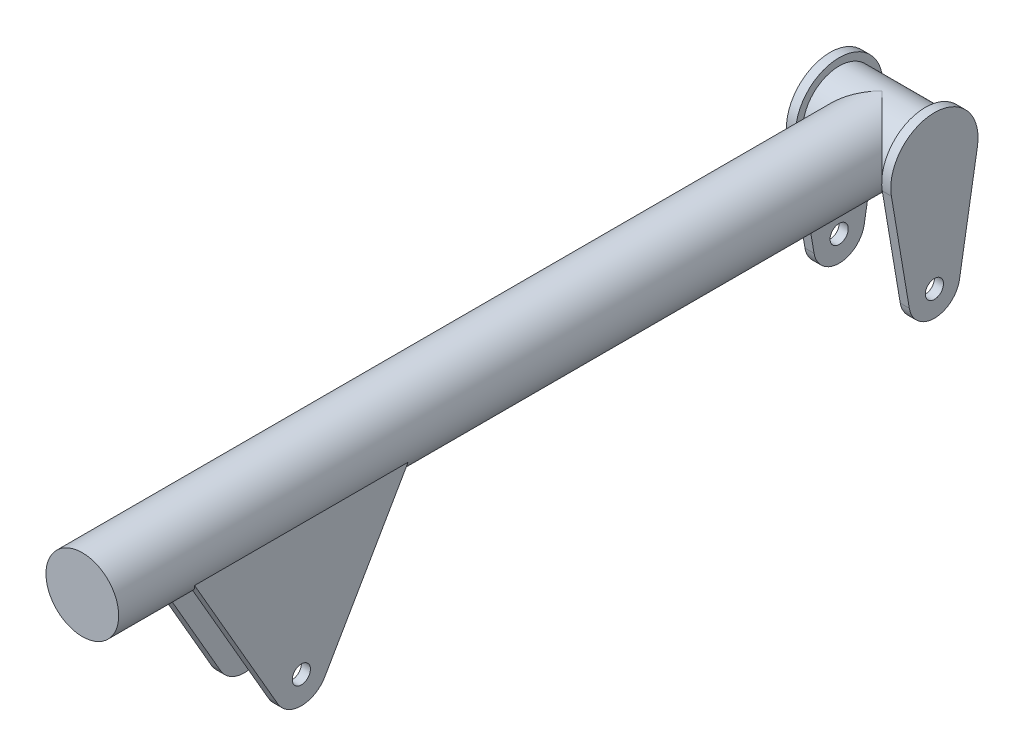
ISO-10303-21;
HEADER;
FILE_DESCRIPTION(('STEP AP214'),'2;1');
FILE_NAME('part.step','',(''),(''),'','','');
FILE_SCHEMA(('AUTOMOTIVE_DESIGN { 1 0 10303 214 1 1 1 1 }'));
ENDSEC;
DATA;
#1=APPLICATION_CONTEXT('core data for automotive mechanical design processes');
#2=APPLICATION_PROTOCOL_DEFINITION('international standard','automotive_design',2000,#1);
#3=PRODUCT_CONTEXT('',#1,'mechanical');
#4=PRODUCT('Part','Part','',(#3));
#5=PRODUCT_RELATED_PRODUCT_CATEGORY('part','',(#4));
#6=PRODUCT_DEFINITION_FORMATION('','',#4);
#7=PRODUCT_DEFINITION_CONTEXT('part definition',#1,'design');
#8=PRODUCT_DEFINITION('design','',#6,#7);
#9=PRODUCT_DEFINITION_SHAPE('','',#8);
#10=(LENGTH_UNIT() NAMED_UNIT(*) SI_UNIT(.MILLI.,.METRE.));
#11=(NAMED_UNIT(*) PLANE_ANGLE_UNIT() SI_UNIT($,.RADIAN.));
#12=(NAMED_UNIT(*) SI_UNIT($,.STERADIAN.) SOLID_ANGLE_UNIT());
#13=UNCERTAINTY_MEASURE_WITH_UNIT(LENGTH_MEASURE(1.E-05),#10,'distance_accuracy_value','');
#14=(GEOMETRIC_REPRESENTATION_CONTEXT(3) GLOBAL_UNCERTAINTY_ASSIGNED_CONTEXT((#13)) GLOBAL_UNIT_ASSIGNED_CONTEXT((#10,
#11,#12)) REPRESENTATION_CONTEXT('',''));
#15=CARTESIAN_POINT('',(0.,0.,0.));
#16=DIRECTION('',(0.,0.,1.));
#17=DIRECTION('',(1.,0.,0.));
#18=AXIS2_PLACEMENT_3D('',#15,#16,#17);
#19=CARTESIAN_POINT('',(0.,0.,279.4));
#20=DIRECTION('',(0.,0.,-1.));
#21=DIRECTION('',(-1.,0.,0.));
#22=AXIS2_PLACEMENT_3D('',#19,#20,#21);
#23=CYLINDRICAL_SURFACE('',#22,12.7);
#24=CARTESIAN_POINT('',(0.,0.,0.));
#25=DIRECTION('',(-0.707106781186547,0.,0.707106781186548));
#26=DIRECTION('',(-0.707106781186547,0.,-0.707106781186548));
#27=AXIS2_PLACEMENT_3D('',#24,#25,#26);
#28=ELLIPSE('',#27,17.9605122421383,12.7);
#29=CARTESIAN_POINT('',(0.,-12.7,0.));
#30=VERTEX_POINT('',#29);
#31=CARTESIAN_POINT('',(0.,12.7,0.));
#32=VERTEX_POINT('',#31);
#33=EDGE_CURVE('E324',#30,#32,#28,.T.);
#34=ORIENTED_EDGE('',*,*,#33,.T.);
#35=CARTESIAN_POINT('',(0.,0.,0.));
#36=DIRECTION('',(-0.707106781186547,0.,-0.707106781186548));
#37=DIRECTION('',(-0.707106781186547,0.,0.707106781186548));
#38=AXIS2_PLACEMENT_3D('',#35,#36,#37);
#39=ELLIPSE('',#38,17.9605122421383,12.7);
#40=EDGE_CURVE('E327',#32,#30,#39,.F.);
#41=ORIENTED_EDGE('',*,*,#40,.T.);
#42=EDGE_LOOP('',(#34,#41));
#43=FACE_BOUND('',#42,.T.);
#44=CARTESIAN_POINT('',(0.,0.,279.4));
#45=DIRECTION('',(0.,0.,1.));
#46=DIRECTION('',(1.,0.,0.));
#47=AXIS2_PLACEMENT_3D('',#44,#45,#46);
#48=CIRCLE('',#47,12.7);
#49=CARTESIAN_POINT('',(12.7,0.,279.4));
#50=VERTEX_POINT('',#49);
#51=EDGE_CURVE('E283',#50,#50,#48,.T.);
#52=ORIENTED_EDGE('',*,*,#51,.F.);
#53=EDGE_LOOP('',(#52));
#54=FACE_BOUND('',#53,.T.);
#55=CARTESIAN_POINT('',(0.,0.,254.785403517121));
#56=DIRECTION('',(0.,0.499999999999998,-0.86602540378444));
#57=DIRECTION('',(0.,-0.86602540378444,-0.499999999999998));
#58=AXIS2_PLACEMENT_3D('',#55,#56,#57);
#59=ELLIPSE('',#58,14.6646968374165,12.7);
#60=CARTESIAN_POINT('',(11.557,-5.2655247601735,251.745351379411));
#61=VERTEX_POINT('',#60);
#62=CARTESIAN_POINT('',(8.382,-9.54107310526442,249.276862391439));
#63=VERTEX_POINT('',#62);
#64=EDGE_CURVE('E333',#61,#63,#59,.T.);
#65=ORIENTED_EDGE('',*,*,#64,.F.);
#66=DIRECTION('',(0.,0.,-1.));
#67=VECTOR('',#66,1.);
#68=CARTESIAN_POINT('',(11.557,-5.26552476017348,279.4));
#69=LINE('',#68,#67);
#70=CARTESIAN_POINT('',(11.557,-5.2655247601735,177.169623049042));
#71=VERTEX_POINT('',#70);
#72=EDGE_CURVE('E12',#61,#71,#69,.T.);
#73=ORIENTED_EDGE('',*,*,#72,.T.);
#74=CARTESIAN_POINT('',(0.,0.,174.129570911331));
#75=DIRECTION('',(0.,0.499999999999998,0.86602540378444));
#76=DIRECTION('',(0.,0.86602540378444,-0.499999999999998));
#77=AXIS2_PLACEMENT_3D('',#74,#75,#76);
#78=ELLIPSE('',#77,14.6646968374165,12.7);
#79=CARTESIAN_POINT('',(8.382,-9.54107310526443,179.638112037013));
#80=VERTEX_POINT('',#79);
#81=EDGE_CURVE('E64',#80,#71,#78,.T.);
#82=ORIENTED_EDGE('',*,*,#81,.F.);
#83=DIRECTION('',(0.,0.,-1.));
#84=VECTOR('',#83,1.);
#85=CARTESIAN_POINT('',(8.382,-9.54107310526442,279.4));
#86=LINE('',#85,#84);
#87=EDGE_CURVE('E330',#63,#80,#86,.T.);
#88=ORIENTED_EDGE('',*,*,#87,.F.);
#89=EDGE_LOOP('',(#65,#73,#82,#88));
#90=FACE_BOUND('',#89,.T.);
#91=CARTESIAN_POINT('',(0.,0.,174.129570911331));
#92=DIRECTION('',(0.,-0.499999999999998,-0.86602540378444));
#93=DIRECTION('',(0.,0.86602540378444,-0.499999999999998));
#94=AXIS2_PLACEMENT_3D('',#91,#92,#93);
#95=ELLIPSE('',#94,14.6646968374165,12.7);
#96=CARTESIAN_POINT('',(-8.382,-9.54107310526442,179.638112037013));
#97=VERTEX_POINT('',#96);
#98=CARTESIAN_POINT('',(-11.557,-5.26552476017348,177.169623049042));
#99=VERTEX_POINT('',#98);
#100=EDGE_CURVE('E71',#97,#99,#95,.T.);
#101=ORIENTED_EDGE('',*,*,#100,.T.);
#102=DIRECTION('',(0.,0.,-1.));
#103=VECTOR('',#102,1.);
#104=CARTESIAN_POINT('',(-11.557,-5.26552476017348,279.4));
#105=LINE('',#104,#103);
#106=CARTESIAN_POINT('',(-11.557,-5.2655247601735,251.745351379411));
#107=VERTEX_POINT('',#106);
#108=EDGE_CURVE('E255',#107,#99,#105,.T.);
#109=ORIENTED_EDGE('',*,*,#108,.F.);
#110=CARTESIAN_POINT('',(0.,0.,254.785403517121));
#111=DIRECTION('',(0.,-0.499999999999998,0.86602540378444));
#112=DIRECTION('',(0.,-0.86602540378444,-0.499999999999998));
#113=AXIS2_PLACEMENT_3D('',#110,#111,#112);
#114=ELLIPSE('',#113,14.6646968374165,12.7);
#115=CARTESIAN_POINT('',(-8.382,-9.54107310526445,249.276862391439));
#116=VERTEX_POINT('',#115);
#117=EDGE_CURVE('E191',#107,#116,#114,.T.);
#118=ORIENTED_EDGE('',*,*,#117,.T.);
#119=DIRECTION('',(0.,0.,-1.));
#120=VECTOR('',#119,1.);
#121=CARTESIAN_POINT('',(-8.382,-9.54107310526442,279.4));
#122=LINE('',#121,#120);
#123=EDGE_CURVE('E76',#116,#97,#122,.T.);
#124=ORIENTED_EDGE('',*,*,#123,.T.);
#125=EDGE_LOOP('',(#101,#109,#118,#124));
#126=FACE_BOUND('',#125,.T.);
#127=ADVANCED_FACE('F56',(#43,#54,#90,#126),#23,.T.);
#128=CARTESIAN_POINT('',(15.0495,0.,0.));
#129=DIRECTION('',(-1.,0.,0.));
#130=DIRECTION('',(0.,0.,1.));
#131=AXIS2_PLACEMENT_3D('',#128,#129,#130);
#132=CYLINDRICAL_SURFACE('',#131,12.7);
#133=CARTESIAN_POINT('',(-15.0495,0.,0.));
#134=DIRECTION('',(1.,0.,0.));
#135=DIRECTION('',(0.,0.,-1.));
#136=AXIS2_PLACEMENT_3D('',#133,#134,#135);
#137=CIRCLE('',#136,12.7);
#138=CARTESIAN_POINT('',(-15.0495,0.,-12.7));
#139=VERTEX_POINT('',#138);
#140=EDGE_CURVE('E244',#139,#139,#137,.T.);
#141=ORIENTED_EDGE('',*,*,#140,.T.);
#142=EDGE_LOOP('',(#141));
#143=FACE_BOUND('',#142,.T.);
#144=CARTESIAN_POINT('',(15.0495,0.,0.));
#145=DIRECTION('',(1.,0.,0.));
#146=DIRECTION('',(0.,0.,-1.));
#147=AXIS2_PLACEMENT_3D('',#144,#145,#146);
#148=CIRCLE('',#147,12.7);
#149=CARTESIAN_POINT('',(15.0495,0.,-12.7));
#150=VERTEX_POINT('',#149);
#151=EDGE_CURVE('E314',#150,#150,#148,.T.);
#152=ORIENTED_EDGE('',*,*,#151,.F.);
#153=EDGE_LOOP('',(#152));
#154=FACE_BOUND('',#153,.T.);
#155=ORIENTED_EDGE('',*,*,#40,.F.);
#156=ORIENTED_EDGE('',*,*,#33,.F.);
#157=EDGE_LOOP('',(#155,#156));
#158=FACE_BOUND('',#157,.T.);
#159=ADVANCED_FACE('F58',(#143,#154,#158),#132,.T.);
#160=CARTESIAN_POINT('',(18.2245,-38.1,0.));
#161=DIRECTION('',(1.,0.,0.));
#162=DIRECTION('',(0.,0.,-1.));
#163=AXIS2_PLACEMENT_3D('',#160,#161,#162);
#164=PLANE('',#163);
#165=DIRECTION('',(0.,-0.986013297183269,0.166666666666667));
#166=VECTOR('',#165,1.);
#167=CARTESIAN_POINT('',(18.2245,-2.54,-15.026842649073));
#168=LINE('',#167,#166);
#169=CARTESIAN_POINT('',(18.2245,-2.54000000000001,-15.026842649073));
#170=VERTEX_POINT('',#169);
#171=CARTESIAN_POINT('',(18.2245,-39.5816666666667,-8.76565821195926));
#172=VERTEX_POINT('',#171);
#173=EDGE_CURVE('E293',#170,#172,#168,.T.);
#174=ORIENTED_EDGE('',*,*,#173,.F.);
#175=CARTESIAN_POINT('',(18.2245,0.,0.));
#176=DIRECTION('',(1.,0.,0.));
#177=DIRECTION('',(0.,0.,-1.));
#178=AXIS2_PLACEMENT_3D('',#175,#176,#177);
#179=CIRCLE('',#178,15.24);
#180=CARTESIAN_POINT('',(18.2245,-2.53999999999999,15.026842649073));
#181=VERTEX_POINT('',#180);
#182=EDGE_CURVE('E301',#170,#181,#179,.T.);
#183=ORIENTED_EDGE('',*,*,#182,.T.);
#184=DIRECTION('',(0.,-0.986013297183269,-0.166666666666667));
#185=VECTOR('',#184,1.);
#186=CARTESIAN_POINT('',(18.2245,-2.54,15.026842649073));
#187=LINE('',#186,#185);
#188=CARTESIAN_POINT('',(18.2245,-39.5816666666667,8.76565821195926));
#189=VERTEX_POINT('',#188);
#190=EDGE_CURVE('E299',#181,#189,#187,.T.);
#191=ORIENTED_EDGE('',*,*,#190,.T.);
#192=CARTESIAN_POINT('',(18.2245,-38.1,0.));
#193=DIRECTION('',(1.,0.,0.));
#194=DIRECTION('',(0.,0.,-1.));
#195=AXIS2_PLACEMENT_3D('',#192,#193,#194);
#196=CIRCLE('',#195,8.89);
#197=EDGE_CURVE('E296',#189,#172,#196,.T.);
#198=ORIENTED_EDGE('',*,*,#197,.T.);
#199=EDGE_LOOP('',(#174,#183,#191,#198));
#200=FACE_BOUND('',#199,.T.);
#201=CARTESIAN_POINT('',(18.2245,-38.1,0.));
#202=DIRECTION('',(1.,0.,0.));
#203=DIRECTION('',(0.,0.,-1.));
#204=AXIS2_PLACEMENT_3D('',#201,#202,#203);
#205=CIRCLE('',#204,3.175);
#206=CARTESIAN_POINT('',(18.2245,-38.1,-3.175));
#207=VERTEX_POINT('',#206);
#208=EDGE_CURVE('E287',#207,#207,#205,.T.);
#209=ORIENTED_EDGE('',*,*,#208,.F.);
#210=EDGE_LOOP('',(#209));
#211=FACE_BOUND('',#210,.T.);
#212=ADVANCED_FACE('F375',(#200,#211),#164,.T.);
#213=CARTESIAN_POINT('',(15.0495,-38.1,0.));
#214=DIRECTION('',(1.,0.,0.));
#215=DIRECTION('',(0.,0.,-1.));
#216=AXIS2_PLACEMENT_3D('',#213,#214,#215);
#217=PLANE('',#216);
#218=ORIENTED_EDGE('',*,*,#151,.T.);
#219=EDGE_LOOP('',(#218));
#220=FACE_BOUND('',#219,.T.);
#221=DIRECTION('',(0.,-0.986013297183269,0.166666666666667));
#222=VECTOR('',#221,1.);
#223=CARTESIAN_POINT('',(15.0495,-2.54,-15.026842649073));
#224=LINE('',#223,#222);
#225=CARTESIAN_POINT('',(15.0495,-2.54000000000001,-15.026842649073));
#226=VERTEX_POINT('',#225);
#227=CARTESIAN_POINT('',(15.0495,-39.5816666666667,-8.76565821195926));
#228=VERTEX_POINT('',#227);
#229=EDGE_CURVE('E290',#226,#228,#224,.T.);
#230=ORIENTED_EDGE('',*,*,#229,.T.);
#231=CARTESIAN_POINT('',(15.0495,-38.1,0.));
#232=DIRECTION('',(1.,0.,0.));
#233=DIRECTION('',(0.,0.,-1.));
#234=AXIS2_PLACEMENT_3D('',#231,#232,#233);
#235=CIRCLE('',#234,8.89);
#236=CARTESIAN_POINT('',(15.0495,-39.5816666666667,8.76565821195926));
#237=VERTEX_POINT('',#236);
#238=EDGE_CURVE('E306',#237,#228,#235,.T.);
#239=ORIENTED_EDGE('',*,*,#238,.F.);
#240=DIRECTION('',(0.,-0.986013297183269,-0.166666666666667));
#241=VECTOR('',#240,1.);
#242=CARTESIAN_POINT('',(15.0495,-2.54,15.026842649073));
#243=LINE('',#242,#241);
#244=CARTESIAN_POINT('',(15.0495,-2.53999999999999,15.026842649073));
#245=VERTEX_POINT('',#244);
#246=EDGE_CURVE('E309',#245,#237,#243,.T.);
#247=ORIENTED_EDGE('',*,*,#246,.F.);
#248=CARTESIAN_POINT('',(15.0495,0.,0.));
#249=DIRECTION('',(1.,0.,0.));
#250=DIRECTION('',(0.,0.,-1.));
#251=AXIS2_PLACEMENT_3D('',#248,#249,#250);
#252=CIRCLE('',#251,15.24);
#253=EDGE_CURVE('E297',#226,#245,#252,.T.);
#254=ORIENTED_EDGE('',*,*,#253,.F.);
#255=EDGE_LOOP('',(#230,#239,#247,#254));
#256=FACE_BOUND('',#255,.T.);
#257=CARTESIAN_POINT('',(15.0495,-38.1,0.));
#258=DIRECTION('',(1.,0.,0.));
#259=DIRECTION('',(0.,0.,-1.));
#260=AXIS2_PLACEMENT_3D('',#257,#258,#259);
#261=CIRCLE('',#260,3.175);
#262=CARTESIAN_POINT('',(15.0495,-38.1,-3.175));
#263=VERTEX_POINT('',#262);
#264=EDGE_CURVE('E286',#263,#263,#261,.T.);
#265=ORIENTED_EDGE('',*,*,#264,.T.);
#266=EDGE_LOOP('',(#265));
#267=FACE_BOUND('',#266,.T.);
#268=ADVANCED_FACE('F388',(#220,#256,#267),#217,.F.);
#269=CARTESIAN_POINT('',(18.2245,-2.54,-15.026842649073));
#270=DIRECTION('',(0.,-0.166666666666667,-0.986013297183269));
#271=DIRECTION('',(0.,0.986013297183269,-0.166666666666667));
#272=AXIS2_PLACEMENT_3D('',#269,#270,#271);
#273=PLANE('',#272);
#274=ORIENTED_EDGE('',*,*,#229,.F.);
#275=DIRECTION('',(-1.,0.,0.));
#276=VECTOR('',#275,1.);
#277=CARTESIAN_POINT('',(18.2245,-2.54000000000001,-15.026842649073));
#278=LINE('',#277,#276);
#279=EDGE_CURVE('E312',#170,#226,#278,.T.);
#280=ORIENTED_EDGE('',*,*,#279,.F.);
#281=ORIENTED_EDGE('',*,*,#173,.T.);
#282=DIRECTION('',(-1.,0.,0.));
#283=VECTOR('',#282,1.);
#284=CARTESIAN_POINT('',(18.2245,-39.5816666666667,-8.76565821195926));
#285=LINE('',#284,#283);
#286=EDGE_CURVE('E303',#172,#228,#285,.T.);
#287=ORIENTED_EDGE('',*,*,#286,.T.);
#288=EDGE_LOOP('',(#274,#280,#281,#287));
#289=FACE_BOUND('',#288,.T.);
#290=ADVANCED_FACE('F392',(#289),#273,.T.);
#291=CARTESIAN_POINT('',(18.2245,0.,0.));
#292=DIRECTION('',(-1.,0.,0.));
#293=DIRECTION('',(0.,0.,1.));
#294=AXIS2_PLACEMENT_3D('',#291,#292,#293);
#295=CYLINDRICAL_SURFACE('',#294,15.24);
#296=ORIENTED_EDGE('',*,*,#253,.T.);
#297=DIRECTION('',(-1.,0.,0.));
#298=VECTOR('',#297,1.);
#299=CARTESIAN_POINT('',(18.2245,-2.53999999999999,15.026842649073));
#300=LINE('',#299,#298);
#301=EDGE_CURVE('E315',#181,#245,#300,.T.);
#302=ORIENTED_EDGE('',*,*,#301,.F.);
#303=ORIENTED_EDGE('',*,*,#182,.F.);
#304=ORIENTED_EDGE('',*,*,#279,.T.);
#305=EDGE_LOOP('',(#296,#302,#303,#304));
#306=FACE_BOUND('',#305,.T.);
#307=ADVANCED_FACE('F394',(#306),#295,.T.);
#308=CARTESIAN_POINT('',(18.2245,-2.54,15.026842649073));
#309=DIRECTION('',(0.,0.166666666666667,-0.986013297183269));
#310=DIRECTION('',(0.,0.986013297183269,0.166666666666667));
#311=AXIS2_PLACEMENT_3D('',#308,#309,#310);
#312=PLANE('',#311);
#313=ORIENTED_EDGE('',*,*,#246,.T.);
#314=DIRECTION('',(-1.,0.,0.));
#315=VECTOR('',#314,1.);
#316=CARTESIAN_POINT('',(18.2245,-39.5816666666667,8.76565821195926));
#317=LINE('',#316,#315);
#318=EDGE_CURVE('E318',#189,#237,#317,.T.);
#319=ORIENTED_EDGE('',*,*,#318,.F.);
#320=ORIENTED_EDGE('',*,*,#190,.F.);
#321=ORIENTED_EDGE('',*,*,#301,.T.);
#322=EDGE_LOOP('',(#313,#319,#320,#321));
#323=FACE_BOUND('',#322,.T.);
#324=ADVANCED_FACE('F397',(#323),#312,.F.);
#325=CARTESIAN_POINT('',(18.2245,-38.1,0.));
#326=DIRECTION('',(-1.,0.,0.));
#327=DIRECTION('',(0.,0.,1.));
#328=AXIS2_PLACEMENT_3D('',#325,#326,#327);
#329=CYLINDRICAL_SURFACE('',#328,8.89);
#330=ORIENTED_EDGE('',*,*,#238,.T.);
#331=ORIENTED_EDGE('',*,*,#286,.F.);
#332=ORIENTED_EDGE('',*,*,#197,.F.);
#333=ORIENTED_EDGE('',*,*,#318,.T.);
#334=EDGE_LOOP('',(#330,#331,#332,#333));
#335=FACE_BOUND('',#334,.T.);
#336=ADVANCED_FACE('F384',(#335),#329,.T.);
#337=CARTESIAN_POINT('',(18.2245,-38.1,0.));
#338=DIRECTION('',(-1.,0.,0.));
#339=DIRECTION('',(0.,0.,1.));
#340=AXIS2_PLACEMENT_3D('',#337,#338,#339);
#341=CYLINDRICAL_SURFACE('',#340,3.175);
#342=ORIENTED_EDGE('',*,*,#208,.T.);
#343=EDGE_LOOP('',(#342));
#344=FACE_BOUND('',#343,.T.);
#345=ORIENTED_EDGE('',*,*,#264,.F.);
#346=EDGE_LOOP('',(#345));
#347=FACE_BOUND('',#346,.T.);
#348=ADVANCED_FACE('F381',(#344,#347),#341,.F.);
#349=CARTESIAN_POINT('',(0.,0.,279.4));
#350=DIRECTION('',(0.,0.,1.));
#351=DIRECTION('',(1.,0.,0.));
#352=AXIS2_PLACEMENT_3D('',#349,#350,#351);
#353=PLANE('',#352);
#354=ORIENTED_EDGE('',*,*,#51,.T.);
#355=EDGE_LOOP('',(#354));
#356=FACE_BOUND('',#355,.T.);
#357=ADVANCED_FACE('F380',(#356),#353,.T.);
#358=CARTESIAN_POINT('',(11.557,0.,0.));
#359=DIRECTION('',(1.,0.,0.));
#360=DIRECTION('',(0.,0.,-1.));
#361=AXIS2_PLACEMENT_3D('',#358,#359,#360);
#362=PLANE('',#361);
#363=CARTESIAN_POINT('',(11.557,-50.8,214.457487214226));
#364=DIRECTION('',(1.,0.,0.));
#365=DIRECTION('',(0.,0.,-1.));
#366=AXIS2_PLACEMENT_3D('',#363,#364,#365);
#367=CIRCLE('',#366,3.17499999999998);
#368=CARTESIAN_POINT('',(11.557,-50.8,211.282487214226));
#369=VERTEX_POINT('',#368);
#370=EDGE_CURVE('E266',#369,#369,#367,.T.);
#371=ORIENTED_EDGE('',*,*,#370,.F.);
#372=EDGE_LOOP('',(#371));
#373=FACE_BOUND('',#372,.T.);
#374=ORIENTED_EDGE('',*,*,#72,.F.);
#375=DIRECTION('',(0.,-0.86602540378444,-0.499999999999998));
#376=VECTOR('',#375,1.);
#377=CARTESIAN_POINT('',(11.557,-110.325315979648,191.089052637841));
#378=LINE('',#377,#376);
#379=CARTESIAN_POINT('',(11.557,-55.5625,222.706379185273));
#380=VERTEX_POINT('',#379);
#381=EDGE_CURVE('E261',#61,#380,#378,.T.);
#382=ORIENTED_EDGE('',*,*,#381,.T.);
#383=CARTESIAN_POINT('',(11.557,-50.8,214.457487214226));
#384=DIRECTION('',(1.,0.,0.));
#385=DIRECTION('',(0.,0.,-1.));
#386=AXIS2_PLACEMENT_3D('',#383,#384,#385);
#387=CIRCLE('',#386,9.525);
#388=CARTESIAN_POINT('',(11.557,-55.5625,206.208595243179));
#389=VERTEX_POINT('',#388);
#390=EDGE_CURVE('E264',#380,#389,#387,.T.);
#391=ORIENTED_EDGE('',*,*,#390,.T.);
#392=DIRECTION('',(0.,0.86602540378444,-0.499999999999998));
#393=VECTOR('',#392,1.);
#394=CARTESIAN_POINT('',(11.557,75.400315979648,130.597178183499));
#395=LINE('',#394,#393);
#396=EDGE_CURVE('E258',#389,#71,#395,.T.);
#397=ORIENTED_EDGE('',*,*,#396,.T.);
#398=EDGE_LOOP('',(#374,#382,#391,#397));
#399=FACE_BOUND('',#398,.T.);
#400=ADVANCED_FACE('F343',(#373,#399),#362,.T.);
#401=CARTESIAN_POINT('',(8.382,0.,0.));
#402=DIRECTION('',(1.,0.,0.));
#403=DIRECTION('',(0.,0.,-1.));
#404=AXIS2_PLACEMENT_3D('',#401,#402,#403);
#405=PLANE('',#404);
#406=CARTESIAN_POINT('',(8.382,-50.8,214.457487214226));
#407=DIRECTION('',(1.,0.,0.));
#408=DIRECTION('',(0.,0.,-1.));
#409=AXIS2_PLACEMENT_3D('',#406,#407,#408);
#410=CIRCLE('',#409,3.17499999999998);
#411=CARTESIAN_POINT('',(8.382,-50.8,211.282487214226));
#412=VERTEX_POINT('',#411);
#413=EDGE_CURVE('E262',#412,#412,#410,.T.);
#414=ORIENTED_EDGE('',*,*,#413,.T.);
#415=EDGE_LOOP('',(#414));
#416=FACE_BOUND('',#415,.T.);
#417=DIRECTION('',(0.,-0.86602540378444,-0.499999999999998));
#418=VECTOR('',#417,1.);
#419=CARTESIAN_POINT('',(8.382,-110.325315979648,191.089052637841));
#420=LINE('',#419,#418);
#421=CARTESIAN_POINT('',(8.382,-55.5625,222.706379185273));
#422=VERTEX_POINT('',#421);
#423=EDGE_CURVE('E272',#63,#422,#420,.T.);
#424=ORIENTED_EDGE('',*,*,#423,.F.);
#425=ORIENTED_EDGE('',*,*,#87,.T.);
#426=DIRECTION('',(0.,0.86602540378444,-0.499999999999998));
#427=VECTOR('',#426,1.);
#428=CARTESIAN_POINT('',(8.382,75.400315979648,130.597178183499));
#429=LINE('',#428,#427);
#430=CARTESIAN_POINT('',(8.382,-55.5625,206.208595243179));
#431=VERTEX_POINT('',#430);
#432=EDGE_CURVE('E257',#431,#80,#429,.T.);
#433=ORIENTED_EDGE('',*,*,#432,.F.);
#434=CARTESIAN_POINT('',(8.382,-50.8,214.457487214226));
#435=DIRECTION('',(1.,0.,0.));
#436=DIRECTION('',(0.,0.,-1.));
#437=AXIS2_PLACEMENT_3D('',#434,#435,#436);
#438=CIRCLE('',#437,9.525);
#439=EDGE_CURVE('E274',#422,#431,#438,.T.);
#440=ORIENTED_EDGE('',*,*,#439,.F.);
#441=EDGE_LOOP('',(#424,#425,#433,#440));
#442=FACE_BOUND('',#441,.T.);
#443=ADVANCED_FACE('F353',(#416,#442),#405,.F.);
#444=CARTESIAN_POINT('',(11.557,75.400315979648,130.597178183499));
#445=DIRECTION('',(0.,0.499999999999998,0.86602540378444));
#446=DIRECTION('',(0.,-0.86602540378444,0.499999999999998));
#447=AXIS2_PLACEMENT_3D('',#444,#445,#446);
#448=PLANE('',#447);
#449=ORIENTED_EDGE('',*,*,#432,.T.);
#450=ORIENTED_EDGE('',*,*,#81,.T.);
#451=ORIENTED_EDGE('',*,*,#396,.F.);
#452=DIRECTION('',(-1.,0.,0.));
#453=VECTOR('',#452,1.);
#454=CARTESIAN_POINT('',(11.557,-55.5625,206.208595243179));
#455=LINE('',#454,#453);
#456=EDGE_CURVE('E269',#389,#431,#455,.T.);
#457=ORIENTED_EDGE('',*,*,#456,.T.);
#458=EDGE_LOOP('',(#449,#450,#451,#457));
#459=FACE_BOUND('',#458,.T.);
#460=ADVANCED_FACE('F338',(#459),#448,.F.);
#461=CARTESIAN_POINT('',(11.557,-110.325315979648,191.089052637841));
#462=DIRECTION('',(0.,0.499999999999998,-0.86602540378444));
#463=DIRECTION('',(0.,0.86602540378444,0.499999999999998));
#464=AXIS2_PLACEMENT_3D('',#461,#462,#463);
#465=PLANE('',#464);
#466=ORIENTED_EDGE('',*,*,#381,.F.);
#467=ORIENTED_EDGE('',*,*,#64,.T.);
#468=ORIENTED_EDGE('',*,*,#423,.T.);
#469=DIRECTION('',(-1.,0.,0.));
#470=VECTOR('',#469,1.);
#471=CARTESIAN_POINT('',(11.557,-55.5625,222.706379185273));
#472=LINE('',#471,#470);
#473=EDGE_CURVE('E280',#380,#422,#472,.T.);
#474=ORIENTED_EDGE('',*,*,#473,.F.);
#475=EDGE_LOOP('',(#466,#467,#468,#474));
#476=FACE_BOUND('',#475,.T.);
#477=ADVANCED_FACE('F355',(#476),#465,.F.);
#478=CARTESIAN_POINT('',(11.557,-50.8,214.457487214226));
#479=DIRECTION('',(-1.,0.,0.));
#480=DIRECTION('',(0.,0.,1.));
#481=AXIS2_PLACEMENT_3D('',#478,#479,#480);
#482=CYLINDRICAL_SURFACE('',#481,9.525);
#483=ORIENTED_EDGE('',*,*,#439,.T.);
#484=ORIENTED_EDGE('',*,*,#456,.F.);
#485=ORIENTED_EDGE('',*,*,#390,.F.);
#486=ORIENTED_EDGE('',*,*,#473,.T.);
#487=EDGE_LOOP('',(#483,#484,#485,#486));
#488=FACE_BOUND('',#487,.T.);
#489=ADVANCED_FACE('F349',(#488),#482,.T.);
#490=CARTESIAN_POINT('',(11.557,-50.8,214.457487214226));
#491=DIRECTION('',(-1.,0.,0.));
#492=DIRECTION('',(0.,0.,1.));
#493=AXIS2_PLACEMENT_3D('',#490,#491,#492);
#494=CYLINDRICAL_SURFACE('',#493,3.17499999999998);
#495=ORIENTED_EDGE('',*,*,#370,.T.);
#496=EDGE_LOOP('',(#495));
#497=FACE_BOUND('',#496,.T.);
#498=ORIENTED_EDGE('',*,*,#413,.F.);
#499=EDGE_LOOP('',(#498));
#500=FACE_BOUND('',#499,.T.);
#501=ADVANCED_FACE('F363',(#497,#500),#494,.F.);
#502=CARTESIAN_POINT('',(-11.557,-50.8,214.457487214226));
#503=DIRECTION('',(1.,0.,0.));
#504=DIRECTION('',(0.,0.,1.));
#505=AXIS2_PLACEMENT_3D('',#502,#503,#504);
#506=CYLINDRICAL_SURFACE('',#505,3.17499999999998);
#507=CARTESIAN_POINT('',(-11.557,-50.8,214.457487214226));
#508=DIRECTION('',(1.,0.,0.));
#509=DIRECTION('',(0.,0.,-1.));
#510=AXIS2_PLACEMENT_3D('',#507,#508,#509);
#511=CIRCLE('',#510,3.17499999999998);
#512=CARTESIAN_POINT('',(-11.557,-50.8,211.282487214226));
#513=VERTEX_POINT('',#512);
#514=EDGE_CURVE('E197',#513,#513,#511,.T.);
#515=ORIENTED_EDGE('',*,*,#514,.F.);
#516=EDGE_LOOP('',(#515));
#517=FACE_BOUND('',#516,.T.);
#518=CARTESIAN_POINT('',(-8.382,-50.8,214.457487214226));
#519=DIRECTION('',(1.,0.,0.));
#520=DIRECTION('',(0.,0.,-1.));
#521=AXIS2_PLACEMENT_3D('',#518,#519,#520);
#522=CIRCLE('',#521,3.17499999999998);
#523=CARTESIAN_POINT('',(-8.382,-50.8,211.282487214226));
#524=VERTEX_POINT('',#523);
#525=EDGE_CURVE('E208',#524,#524,#522,.T.);
#526=ORIENTED_EDGE('',*,*,#525,.T.);
#527=EDGE_LOOP('',(#526));
#528=FACE_BOUND('',#527,.T.);
#529=ADVANCED_FACE('F442',(#517,#528),#506,.F.);
#530=CARTESIAN_POINT('',(-11.557,-50.8,214.457487214226));
#531=DIRECTION('',(1.,0.,0.));
#532=DIRECTION('',(0.,0.,1.));
#533=AXIS2_PLACEMENT_3D('',#530,#531,#532);
#534=CYLINDRICAL_SURFACE('',#533,9.525);
#535=CARTESIAN_POINT('',(-8.382,-50.8,214.457487214226));
#536=DIRECTION('',(1.,0.,0.));
#537=DIRECTION('',(0.,0.,-1.));
#538=AXIS2_PLACEMENT_3D('',#535,#536,#537);
#539=CIRCLE('',#538,9.525);
#540=CARTESIAN_POINT('',(-8.382,-55.5625,222.706379185273));
#541=VERTEX_POINT('',#540);
#542=CARTESIAN_POINT('',(-8.382,-55.5625,206.208595243179));
#543=VERTEX_POINT('',#542);
#544=EDGE_CURVE('E180',#541,#543,#539,.T.);
#545=ORIENTED_EDGE('',*,*,#544,.F.);
#546=DIRECTION('',(1.,0.,0.));
#547=VECTOR('',#546,1.);
#548=CARTESIAN_POINT('',(-11.557,-55.5625,222.706379185273));
#549=LINE('',#548,#547);
#550=CARTESIAN_POINT('',(-11.557,-55.5625,222.706379185273));
#551=VERTEX_POINT('',#550);
#552=EDGE_CURVE('E173',#551,#541,#549,.T.);
#553=ORIENTED_EDGE('',*,*,#552,.F.);
#554=CARTESIAN_POINT('',(-11.557,-50.8,214.457487214226));
#555=DIRECTION('',(1.,0.,0.));
#556=DIRECTION('',(0.,0.,-1.));
#557=AXIS2_PLACEMENT_3D('',#554,#555,#556);
#558=CIRCLE('',#557,9.525);
#559=CARTESIAN_POINT('',(-11.557,-55.5625,206.208595243179));
#560=VERTEX_POINT('',#559);
#561=EDGE_CURVE('E177',#551,#560,#558,.T.);
#562=ORIENTED_EDGE('',*,*,#561,.T.);
#563=DIRECTION('',(1.,0.,0.));
#564=VECTOR('',#563,1.);
#565=CARTESIAN_POINT('',(-11.557,-55.5625,206.208595243179));
#566=LINE('',#565,#564);
#567=EDGE_CURVE('E185',#560,#543,#566,.T.);
#568=ORIENTED_EDGE('',*,*,#567,.T.);
#569=EDGE_LOOP('',(#545,#553,#562,#568));
#570=FACE_BOUND('',#569,.T.);
#571=ADVANCED_FACE('F175',(#570),#534,.T.);
#572=CARTESIAN_POINT('',(-11.557,75.400315979648,130.597178183499));
#573=DIRECTION('',(0.,0.499999999999998,0.86602540378444));
#574=DIRECTION('',(0.,-0.86602540378444,0.499999999999998));
#575=AXIS2_PLACEMENT_3D('',#572,#573,#574);
#576=PLANE('',#575);
#577=DIRECTION('',(0.,0.86602540378444,-0.499999999999998));
#578=VECTOR('',#577,1.);
#579=CARTESIAN_POINT('',(-8.382,75.400315979648,130.597178183499));
#580=LINE('',#579,#578);
#581=EDGE_CURVE('E203',#543,#97,#580,.T.);
#582=ORIENTED_EDGE('',*,*,#581,.F.);
#583=ORIENTED_EDGE('',*,*,#567,.F.);
#584=DIRECTION('',(0.,0.86602540378444,-0.499999999999998));
#585=VECTOR('',#584,1.);
#586=CARTESIAN_POINT('',(-11.557,75.400315979648,130.597178183499));
#587=LINE('',#586,#585);
#588=EDGE_CURVE('E194',#560,#99,#587,.T.);
#589=ORIENTED_EDGE('',*,*,#588,.T.);
#590=ORIENTED_EDGE('',*,*,#100,.F.);
#591=EDGE_LOOP('',(#582,#583,#589,#590));
#592=FACE_BOUND('',#591,.T.);
#593=ADVANCED_FACE('F534',(#592),#576,.F.);
#594=CARTESIAN_POINT('',(-11.557,-110.325315979648,191.089052637841));
#595=DIRECTION('',(0.,0.499999999999998,-0.86602540378444));
#596=DIRECTION('',(0.,0.86602540378444,0.499999999999998));
#597=AXIS2_PLACEMENT_3D('',#594,#595,#596);
#598=PLANE('',#597);
#599=DIRECTION('',(0.,-0.86602540378444,-0.499999999999998));
#600=VECTOR('',#599,1.);
#601=CARTESIAN_POINT('',(-11.557,-110.325315979648,191.089052637841));
#602=LINE('',#601,#600);
#603=EDGE_CURVE('E189',#107,#551,#602,.T.);
#604=ORIENTED_EDGE('',*,*,#603,.T.);
#605=ORIENTED_EDGE('',*,*,#552,.T.);
#606=DIRECTION('',(0.,-0.86602540378444,-0.499999999999998));
#607=VECTOR('',#606,1.);
#608=CARTESIAN_POINT('',(-8.382,-110.325315979648,191.089052637841));
#609=LINE('',#608,#607);
#610=EDGE_CURVE('E205',#116,#541,#609,.T.);
#611=ORIENTED_EDGE('',*,*,#610,.F.);
#612=ORIENTED_EDGE('',*,*,#117,.F.);
#613=EDGE_LOOP('',(#604,#605,#611,#612));
#614=FACE_BOUND('',#613,.T.);
#615=ADVANCED_FACE('F190',(#614),#598,.F.);
#616=CARTESIAN_POINT('',(-8.382,0.,0.));
#617=DIRECTION('',(-1.,0.,0.));
#618=DIRECTION('',(0.,0.,-1.));
#619=AXIS2_PLACEMENT_3D('',#616,#617,#618);
#620=PLANE('',#619);
#621=ORIENTED_EDGE('',*,*,#525,.F.);
#622=EDGE_LOOP('',(#621));
#623=FACE_BOUND('',#622,.T.);
#624=ORIENTED_EDGE('',*,*,#610,.T.);
#625=ORIENTED_EDGE('',*,*,#544,.T.);
#626=ORIENTED_EDGE('',*,*,#581,.T.);
#627=ORIENTED_EDGE('',*,*,#123,.F.);
#628=EDGE_LOOP('',(#624,#625,#626,#627));
#629=FACE_BOUND('',#628,.T.);
#630=ADVANCED_FACE('F520',(#623,#629),#620,.F.);
#631=CARTESIAN_POINT('',(-11.557,0.,0.));
#632=DIRECTION('',(-1.,0.,0.));
#633=DIRECTION('',(0.,0.,-1.));
#634=AXIS2_PLACEMENT_3D('',#631,#632,#633);
#635=PLANE('',#634);
#636=ORIENTED_EDGE('',*,*,#514,.T.);
#637=EDGE_LOOP('',(#636));
#638=FACE_BOUND('',#637,.T.);
#639=ORIENTED_EDGE('',*,*,#108,.T.);
#640=ORIENTED_EDGE('',*,*,#588,.F.);
#641=ORIENTED_EDGE('',*,*,#561,.F.);
#642=ORIENTED_EDGE('',*,*,#603,.F.);
#643=EDGE_LOOP('',(#639,#640,#641,#642));
#644=FACE_BOUND('',#643,.T.);
#645=ADVANCED_FACE('F196',(#638,#644),#635,.T.);
#646=CARTESIAN_POINT('',(-18.2245,-38.1,0.));
#647=DIRECTION('',(-1.,0.,0.));
#648=DIRECTION('',(0.,0.,-1.));
#649=AXIS2_PLACEMENT_3D('',#646,#647,#648);
#650=PLANE('',#649);
#651=DIRECTION('',(0.,-0.986013297183269,0.166666666666667));
#652=VECTOR('',#651,1.);
#653=CARTESIAN_POINT('',(-18.2245,-2.54,-15.026842649073));
#654=LINE('',#653,#652);
#655=CARTESIAN_POINT('',(-18.2245,-2.54000000000001,-15.026842649073));
#656=VERTEX_POINT('',#655);
#657=CARTESIAN_POINT('',(-18.2245,-39.5816666666667,-8.76565821195926));
#658=VERTEX_POINT('',#657);
#659=EDGE_CURVE('E218',#656,#658,#654,.T.);
#660=ORIENTED_EDGE('',*,*,#659,.T.);
#661=CARTESIAN_POINT('',(-18.2245,-38.1,0.));
#662=DIRECTION('',(1.,0.,0.));
#663=DIRECTION('',(0.,0.,-1.));
#664=AXIS2_PLACEMENT_3D('',#661,#662,#663);
#665=CIRCLE('',#664,8.89);
#666=CARTESIAN_POINT('',(-18.2245,-39.5816666666667,8.76565821195926));
#667=VERTEX_POINT('',#666);
#668=EDGE_CURVE('E221',#667,#658,#665,.T.);
#669=ORIENTED_EDGE('',*,*,#668,.F.);
#670=DIRECTION('',(0.,-0.986013297183269,-0.166666666666667));
#671=VECTOR('',#670,1.);
#672=CARTESIAN_POINT('',(-18.2245,-2.54,15.026842649073));
#673=LINE('',#672,#671);
#674=CARTESIAN_POINT('',(-18.2245,-2.53999999999999,15.026842649073));
#675=VERTEX_POINT('',#674);
#676=EDGE_CURVE('E225',#675,#667,#673,.T.);
#677=ORIENTED_EDGE('',*,*,#676,.F.);
#678=CARTESIAN_POINT('',(-18.2245,0.,0.));
#679=DIRECTION('',(1.,0.,0.));
#680=DIRECTION('',(0.,0.,-1.));
#681=AXIS2_PLACEMENT_3D('',#678,#679,#680);
#682=CIRCLE('',#681,15.24);
#683=EDGE_CURVE('E228',#656,#675,#682,.T.);
#684=ORIENTED_EDGE('',*,*,#683,.F.);
#685=EDGE_LOOP('',(#660,#669,#677,#684));
#686=FACE_BOUND('',#685,.T.);
#687=CARTESIAN_POINT('',(-18.2245,-38.1,0.));
#688=DIRECTION('',(1.,0.,0.));
#689=DIRECTION('',(0.,0.,-1.));
#690=AXIS2_PLACEMENT_3D('',#687,#688,#689);
#691=CIRCLE('',#690,3.175);
#692=CARTESIAN_POINT('',(-18.2245,-38.1,-3.175));
#693=VERTEX_POINT('',#692);
#694=EDGE_CURVE('E212',#693,#693,#691,.T.);
#695=ORIENTED_EDGE('',*,*,#694,.T.);
#696=EDGE_LOOP('',(#695));
#697=FACE_BOUND('',#696,.T.);
#698=ADVANCED_FACE('F453',(#686,#697),#650,.T.);
#699=CARTESIAN_POINT('',(-15.0495,-38.1,0.));
#700=DIRECTION('',(-1.,0.,0.));
#701=DIRECTION('',(0.,0.,-1.));
#702=AXIS2_PLACEMENT_3D('',#699,#700,#701);
#703=PLANE('',#702);
#704=ORIENTED_EDGE('',*,*,#140,.F.);
#705=EDGE_LOOP('',(#704));
#706=FACE_BOUND('',#705,.T.);
#707=DIRECTION('',(0.,-0.986013297183269,0.166666666666667));
#708=VECTOR('',#707,1.);
#709=CARTESIAN_POINT('',(-15.0495,-2.54,-15.026842649073));
#710=LINE('',#709,#708);
#711=CARTESIAN_POINT('',(-15.0495,-2.54000000000001,-15.026842649073));
#712=VERTEX_POINT('',#711);
#713=CARTESIAN_POINT('',(-15.0495,-39.5816666666667,-8.76565821195926));
#714=VERTEX_POINT('',#713);
#715=EDGE_CURVE('E215',#712,#714,#710,.T.);
#716=ORIENTED_EDGE('',*,*,#715,.F.);
#717=CARTESIAN_POINT('',(-15.0495,0.,0.));
#718=DIRECTION('',(1.,0.,0.));
#719=DIRECTION('',(0.,0.,-1.));
#720=AXIS2_PLACEMENT_3D('',#717,#718,#719);
#721=CIRCLE('',#720,15.24);
#722=CARTESIAN_POINT('',(-15.0495,-2.53999999999999,15.026842649073));
#723=VERTEX_POINT('',#722);
#724=EDGE_CURVE('E222',#712,#723,#721,.T.);
#725=ORIENTED_EDGE('',*,*,#724,.T.);
#726=DIRECTION('',(0.,-0.986013297183269,-0.166666666666667));
#727=VECTOR('',#726,1.);
#728=CARTESIAN_POINT('',(-15.0495,-2.54,15.026842649073));
#729=LINE('',#728,#727);
#730=CARTESIAN_POINT('',(-15.0495,-39.5816666666667,8.76565821195926));
#731=VERTEX_POINT('',#730);
#732=EDGE_CURVE('E237',#723,#731,#729,.T.);
#733=ORIENTED_EDGE('',*,*,#732,.T.);
#734=CARTESIAN_POINT('',(-15.0495,-38.1,0.));
#735=DIRECTION('',(1.,0.,0.));
#736=DIRECTION('',(0.,0.,-1.));
#737=AXIS2_PLACEMENT_3D('',#734,#735,#736);
#738=CIRCLE('',#737,8.89);
#739=EDGE_CURVE('E234',#731,#714,#738,.T.);
#740=ORIENTED_EDGE('',*,*,#739,.T.);
#741=EDGE_LOOP('',(#716,#725,#733,#740));
#742=FACE_BOUND('',#741,.T.);
#743=CARTESIAN_POINT('',(-15.0495,-38.1,0.));
#744=DIRECTION('',(1.,0.,0.));
#745=DIRECTION('',(0.,0.,-1.));
#746=AXIS2_PLACEMENT_3D('',#743,#744,#745);
#747=CIRCLE('',#746,3.175);
#748=CARTESIAN_POINT('',(-15.0495,-38.1,-3.175));
#749=VERTEX_POINT('',#748);
#750=EDGE_CURVE('E184',#749,#749,#747,.T.);
#751=ORIENTED_EDGE('',*,*,#750,.F.);
#752=EDGE_LOOP('',(#751));
#753=FACE_BOUND('',#752,.T.);
#754=ADVANCED_FACE('F458',(#706,#742,#753),#703,.F.);
#755=CARTESIAN_POINT('',(-18.2245,-2.54,-15.026842649073));
#756=DIRECTION('',(0.,-0.166666666666667,-0.986013297183269));
#757=DIRECTION('',(0.,0.986013297183269,-0.166666666666667));
#758=AXIS2_PLACEMENT_3D('',#755,#756,#757);
#759=PLANE('',#758);
#760=ORIENTED_EDGE('',*,*,#715,.T.);
#761=DIRECTION('',(1.,0.,0.));
#762=VECTOR('',#761,1.);
#763=CARTESIAN_POINT('',(-18.2245,-39.5816666666667,-8.76565821195926));
#764=LINE('',#763,#762);
#765=EDGE_CURVE('E231',#658,#714,#764,.T.);
#766=ORIENTED_EDGE('',*,*,#765,.F.);
#767=ORIENTED_EDGE('',*,*,#659,.F.);
#768=DIRECTION('',(1.,0.,0.));
#769=VECTOR('',#768,1.);
#770=CARTESIAN_POINT('',(-18.2245,-2.54000000000001,-15.026842649073));
#771=LINE('',#770,#769);
#772=EDGE_CURVE('E242',#656,#712,#771,.T.);
#773=ORIENTED_EDGE('',*,*,#772,.T.);
#774=EDGE_LOOP('',(#760,#766,#767,#773));
#775=FACE_BOUND('',#774,.T.);
#776=ADVANCED_FACE('F468',(#775),#759,.T.);
#777=CARTESIAN_POINT('',(-18.2245,0.,0.));
#778=DIRECTION('',(1.,0.,0.));
#779=DIRECTION('',(0.,0.,1.));
#780=AXIS2_PLACEMENT_3D('',#777,#778,#779);
#781=CYLINDRICAL_SURFACE('',#780,15.24);
#782=ORIENTED_EDGE('',*,*,#724,.F.);
#783=ORIENTED_EDGE('',*,*,#772,.F.);
#784=ORIENTED_EDGE('',*,*,#683,.T.);
#785=DIRECTION('',(1.,0.,0.));
#786=VECTOR('',#785,1.);
#787=CARTESIAN_POINT('',(-18.2245,-2.53999999999999,15.026842649073));
#788=LINE('',#787,#786);
#789=EDGE_CURVE('E245',#675,#723,#788,.T.);
#790=ORIENTED_EDGE('',*,*,#789,.T.);
#791=EDGE_LOOP('',(#782,#783,#784,#790));
#792=FACE_BOUND('',#791,.T.);
#793=ADVANCED_FACE('F477',(#792),#781,.T.);
#794=CARTESIAN_POINT('',(-18.2245,-2.54,15.026842649073));
#795=DIRECTION('',(0.,0.166666666666667,-0.986013297183269));
#796=DIRECTION('',(0.,0.986013297183269,0.166666666666667));
#797=AXIS2_PLACEMENT_3D('',#794,#795,#796);
#798=PLANE('',#797);
#799=ORIENTED_EDGE('',*,*,#732,.F.);
#800=ORIENTED_EDGE('',*,*,#789,.F.);
#801=ORIENTED_EDGE('',*,*,#676,.T.);
#802=DIRECTION('',(1.,0.,0.));
#803=VECTOR('',#802,1.);
#804=CARTESIAN_POINT('',(-18.2245,-39.5816666666667,8.76565821195926));
#805=LINE('',#804,#803);
#806=EDGE_CURVE('E247',#667,#731,#805,.T.);
#807=ORIENTED_EDGE('',*,*,#806,.T.);
#808=EDGE_LOOP('',(#799,#800,#801,#807));
#809=FACE_BOUND('',#808,.T.);
#810=ADVANCED_FACE('F486',(#809),#798,.F.);
#811=CARTESIAN_POINT('',(-18.2245,-38.1,0.));
#812=DIRECTION('',(1.,0.,0.));
#813=DIRECTION('',(0.,0.,1.));
#814=AXIS2_PLACEMENT_3D('',#811,#812,#813);
#815=CYLINDRICAL_SURFACE('',#814,8.89);
#816=ORIENTED_EDGE('',*,*,#739,.F.);
#817=ORIENTED_EDGE('',*,*,#806,.F.);
#818=ORIENTED_EDGE('',*,*,#668,.T.);
#819=ORIENTED_EDGE('',*,*,#765,.T.);
#820=EDGE_LOOP('',(#816,#817,#818,#819));
#821=FACE_BOUND('',#820,.T.);
#822=ADVANCED_FACE('F495',(#821),#815,.T.);
#823=CARTESIAN_POINT('',(-18.2245,-38.1,0.));
#824=DIRECTION('',(1.,0.,0.));
#825=DIRECTION('',(0.,0.,1.));
#826=AXIS2_PLACEMENT_3D('',#823,#824,#825);
#827=CYLINDRICAL_SURFACE('',#826,3.175);
#828=ORIENTED_EDGE('',*,*,#694,.F.);
#829=EDGE_LOOP('',(#828));
#830=FACE_BOUND('',#829,.T.);
#831=ORIENTED_EDGE('',*,*,#750,.T.);
#832=EDGE_LOOP('',(#831));
#833=FACE_BOUND('',#832,.T.);
#834=ADVANCED_FACE('F504',(#830,#833),#827,.F.);
#835=CLOSED_SHELL('',(#127,#159,#212,#268,#290,#307,#324,#336,#348,#357,#400,#443,#460,#477,
#489,#501,#529,#571,#593,#615,#630,#645,#698,#754,#776,#793,#810,#822,#834));
#836=MANIFOLD_SOLID_BREP('B2',#835);
#837=ADVANCED_BREP_SHAPE_REPRESENTATION('',(#18,#836),#14);
#838=SHAPE_DEFINITION_REPRESENTATION(#9,#837);
ENDSEC;
END-ISO-10303-21;
